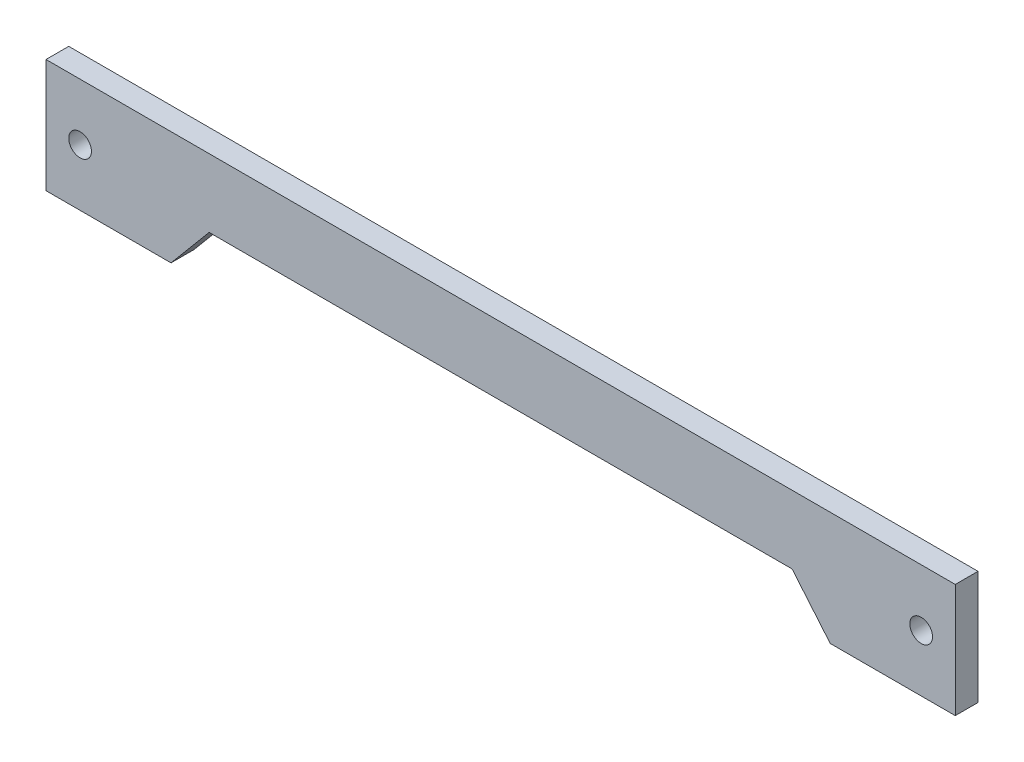
ISO-10303-21;
HEADER;
FILE_DESCRIPTION(('STEP AP214'),'2;1');
FILE_NAME('part.step','',(''),(''),'','','');
FILE_SCHEMA(('AUTOMOTIVE_DESIGN { 1 0 10303 214 1 1 1 1 }'));
ENDSEC;
DATA;
#1=APPLICATION_CONTEXT('core data for automotive mechanical design processes');
#2=APPLICATION_PROTOCOL_DEFINITION('international standard','automotive_design',2000,#1);
#3=PRODUCT_CONTEXT('',#1,'mechanical');
#4=PRODUCT('Part','Part','',(#3));
#5=PRODUCT_RELATED_PRODUCT_CATEGORY('part','',(#4));
#6=PRODUCT_DEFINITION_FORMATION('','',#4);
#7=PRODUCT_DEFINITION_CONTEXT('part definition',#1,'design');
#8=PRODUCT_DEFINITION('design','',#6,#7);
#9=PRODUCT_DEFINITION_SHAPE('','',#8);
#10=(LENGTH_UNIT() NAMED_UNIT(*) SI_UNIT(.MILLI.,.METRE.));
#11=(NAMED_UNIT(*) PLANE_ANGLE_UNIT() SI_UNIT($,.RADIAN.));
#12=(NAMED_UNIT(*) SI_UNIT($,.STERADIAN.) SOLID_ANGLE_UNIT());
#13=UNCERTAINTY_MEASURE_WITH_UNIT(LENGTH_MEASURE(1.E-05),#10,'distance_accuracy_value','');
#14=(GEOMETRIC_REPRESENTATION_CONTEXT(3) GLOBAL_UNCERTAINTY_ASSIGNED_CONTEXT((#13)) GLOBAL_UNIT_ASSIGNED_CONTEXT((#10,
#11,#12)) REPRESENTATION_CONTEXT('',''));
#15=CARTESIAN_POINT('',(0.,0.,0.));
#16=DIRECTION('',(0.,0.,1.));
#17=DIRECTION('',(1.,0.,0.));
#18=AXIS2_PLACEMENT_3D('',#15,#16,#17);
#19=CARTESIAN_POINT('',(80.,-20.,4.));
#20=DIRECTION('',(0.,1.,0.));
#21=DIRECTION('',(-1.,0.,0.));
#22=AXIS2_PLACEMENT_3D('',#19,#20,#21);
#23=PLANE('',#22);
#24=DIRECTION('',(1.,0.,0.));
#25=VECTOR('',#24,1.);
#26=CARTESIAN_POINT('',(80.,-20.,0.));
#27=LINE('',#26,#25);
#28=CARTESIAN_POINT('',(58.,-20.,0.));
#29=VERTEX_POINT('',#28);
#30=CARTESIAN_POINT('',(80.,-20.,0.));
#31=VERTEX_POINT('',#30);
#32=EDGE_CURVE('E160',#29,#31,#27,.T.);
#33=ORIENTED_EDGE('',*,*,#32,.T.);
#34=DIRECTION('',(0.,0.,-1.));
#35=VECTOR('',#34,1.);
#36=CARTESIAN_POINT('',(80.,-20.,4.));
#37=LINE('',#36,#35);
#38=CARTESIAN_POINT('',(80.,-20.,4.));
#39=VERTEX_POINT('',#38);
#40=EDGE_CURVE('E11',#39,#31,#37,.T.);
#41=ORIENTED_EDGE('',*,*,#40,.F.);
#42=DIRECTION('',(1.,0.,0.));
#43=VECTOR('',#42,1.);
#44=CARTESIAN_POINT('',(80.,-20.,4.));
#45=LINE('',#44,#43);
#46=CARTESIAN_POINT('',(58.,-20.,4.));
#47=VERTEX_POINT('',#46);
#48=EDGE_CURVE('E181',#47,#39,#45,.T.);
#49=ORIENTED_EDGE('',*,*,#48,.F.);
#50=DIRECTION('',(0.,0.,-1.));
#51=VECTOR('',#50,1.);
#52=CARTESIAN_POINT('',(58.,-20.,4.));
#53=LINE('',#52,#51);
#54=EDGE_CURVE('E156',#47,#29,#53,.T.);
#55=ORIENTED_EDGE('',*,*,#54,.T.);
#56=EDGE_LOOP('',(#33,#41,#49,#55));
#57=FACE_BOUND('',#56,.T.);
#58=ADVANCED_FACE('F42',(#57),#23,.F.);
#59=CARTESIAN_POINT('',(80.,0.,4.));
#60=DIRECTION('',(-1.,0.,0.));
#61=DIRECTION('',(0.,0.,1.));
#62=AXIS2_PLACEMENT_3D('',#59,#60,#61);
#63=PLANE('',#62);
#64=DIRECTION('',(0.,1.,0.));
#65=VECTOR('',#64,1.);
#66=CARTESIAN_POINT('',(80.,0.,0.));
#67=LINE('',#66,#65);
#68=CARTESIAN_POINT('',(80.,0.,0.));
#69=VERTEX_POINT('',#68);
#70=EDGE_CURVE('E164',#31,#69,#67,.T.);
#71=ORIENTED_EDGE('',*,*,#70,.T.);
#72=DIRECTION('',(0.,0.,-1.));
#73=VECTOR('',#72,1.);
#74=CARTESIAN_POINT('',(80.,0.,4.));
#75=LINE('',#74,#73);
#76=CARTESIAN_POINT('',(80.,0.,4.));
#77=VERTEX_POINT('',#76);
#78=EDGE_CURVE('E51',#77,#69,#75,.T.);
#79=ORIENTED_EDGE('',*,*,#78,.F.);
#80=DIRECTION('',(0.,1.,0.));
#81=VECTOR('',#80,1.);
#82=CARTESIAN_POINT('',(80.,0.,4.));
#83=LINE('',#82,#81);
#84=EDGE_CURVE('E113',#39,#77,#83,.T.);
#85=ORIENTED_EDGE('',*,*,#84,.F.);
#86=ORIENTED_EDGE('',*,*,#40,.T.);
#87=EDGE_LOOP('',(#71,#79,#85,#86));
#88=FACE_BOUND('',#87,.T.);
#89=ADVANCED_FACE('F263',(#88),#63,.F.);
#90=CARTESIAN_POINT('',(80.,0.,4.));
#91=DIRECTION('',(0.,-1.,0.));
#92=DIRECTION('',(0.,0.,-1.));
#93=AXIS2_PLACEMENT_3D('',#90,#91,#92);
#94=PLANE('',#93);
#95=DIRECTION('',(-1.,0.,0.));
#96=VECTOR('',#95,1.);
#97=CARTESIAN_POINT('',(80.,0.,0.));
#98=LINE('',#97,#96);
#99=CARTESIAN_POINT('',(-80.,0.,0.));
#100=VERTEX_POINT('',#99);
#101=EDGE_CURVE('E168',#69,#100,#98,.T.);
#102=ORIENTED_EDGE('',*,*,#101,.T.);
#103=DIRECTION('',(0.,0.,-1.));
#104=VECTOR('',#103,1.);
#105=CARTESIAN_POINT('',(-80.,0.,4.));
#106=LINE('',#105,#104);
#107=CARTESIAN_POINT('',(-80.,0.,4.));
#108=VERTEX_POINT('',#107);
#109=EDGE_CURVE('E192',#108,#100,#106,.T.);
#110=ORIENTED_EDGE('',*,*,#109,.F.);
#111=DIRECTION('',(-1.,0.,0.));
#112=VECTOR('',#111,1.);
#113=CARTESIAN_POINT('',(80.,0.,4.));
#114=LINE('',#113,#112);
#115=EDGE_CURVE('E202',#77,#108,#114,.T.);
#116=ORIENTED_EDGE('',*,*,#115,.F.);
#117=ORIENTED_EDGE('',*,*,#78,.T.);
#118=EDGE_LOOP('',(#102,#110,#116,#117));
#119=FACE_BOUND('',#118,.T.);
#120=ADVANCED_FACE('F200',(#119),#94,.F.);
#121=CARTESIAN_POINT('',(-80.,0.,4.));
#122=DIRECTION('',(1.,0.,0.));
#123=DIRECTION('',(0.,0.,-1.));
#124=AXIS2_PLACEMENT_3D('',#121,#122,#123);
#125=PLANE('',#124);
#126=DIRECTION('',(0.,-1.,0.));
#127=VECTOR('',#126,1.);
#128=CARTESIAN_POINT('',(-80.,0.,0.));
#129=LINE('',#128,#127);
#130=CARTESIAN_POINT('',(-80.,-20.,0.));
#131=VERTEX_POINT('',#130);
#132=EDGE_CURVE('E170',#100,#131,#129,.T.);
#133=ORIENTED_EDGE('',*,*,#132,.T.);
#134=DIRECTION('',(0.,0.,-1.));
#135=VECTOR('',#134,1.);
#136=CARTESIAN_POINT('',(-80.,-20.,4.));
#137=LINE('',#136,#135);
#138=CARTESIAN_POINT('',(-80.,-20.,4.));
#139=VERTEX_POINT('',#138);
#140=EDGE_CURVE('E188',#139,#131,#137,.T.);
#141=ORIENTED_EDGE('',*,*,#140,.F.);
#142=DIRECTION('',(0.,-1.,0.));
#143=VECTOR('',#142,1.);
#144=CARTESIAN_POINT('',(-80.,0.,4.));
#145=LINE('',#144,#143);
#146=EDGE_CURVE('E215',#108,#139,#145,.T.);
#147=ORIENTED_EDGE('',*,*,#146,.F.);
#148=ORIENTED_EDGE('',*,*,#109,.T.);
#149=EDGE_LOOP('',(#133,#141,#147,#148));
#150=FACE_BOUND('',#149,.T.);
#151=ADVANCED_FACE('F210',(#150),#125,.F.);
#152=CARTESIAN_POINT('',(-80.,-20.,4.));
#153=DIRECTION('',(0.,1.,0.));
#154=DIRECTION('',(0.,0.,1.));
#155=AXIS2_PLACEMENT_3D('',#152,#153,#154);
#156=PLANE('',#155);
#157=DIRECTION('',(1.,0.,0.));
#158=VECTOR('',#157,1.);
#159=CARTESIAN_POINT('',(-80.,-20.,0.));
#160=LINE('',#159,#158);
#161=CARTESIAN_POINT('',(-58.,-20.,0.));
#162=VERTEX_POINT('',#161);
#163=EDGE_CURVE('E173',#131,#162,#160,.T.);
#164=ORIENTED_EDGE('',*,*,#163,.T.);
#165=DIRECTION('',(0.,0.,-1.));
#166=VECTOR('',#165,1.);
#167=CARTESIAN_POINT('',(-58.,-20.,4.));
#168=LINE('',#167,#166);
#169=CARTESIAN_POINT('',(-58.,-20.,4.));
#170=VERTEX_POINT('',#169);
#171=EDGE_CURVE('E147',#170,#162,#168,.T.);
#172=ORIENTED_EDGE('',*,*,#171,.F.);
#173=DIRECTION('',(1.,0.,0.));
#174=VECTOR('',#173,1.);
#175=CARTESIAN_POINT('',(-80.,-20.,4.));
#176=LINE('',#175,#174);
#177=EDGE_CURVE('E136',#139,#170,#176,.T.);
#178=ORIENTED_EDGE('',*,*,#177,.F.);
#179=ORIENTED_EDGE('',*,*,#140,.T.);
#180=EDGE_LOOP('',(#164,#172,#178,#179));
#181=FACE_BOUND('',#180,.T.);
#182=ADVANCED_FACE('F213',(#181),#156,.F.);
#183=CARTESIAN_POINT('',(-58.,-20.,4.));
#184=DIRECTION('',(-0.76604444311898,0.642787609686537,0.));
#185=DIRECTION('',(-0.642787609686537,-0.76604444311898,0.));
#186=AXIS2_PLACEMENT_3D('',#183,#184,#185);
#187=PLANE('',#186);
#188=DIRECTION('',(0.642787609686537,0.76604444311898,0.));
#189=VECTOR('',#188,1.);
#190=CARTESIAN_POINT('',(-58.,-20.,0.));
#191=LINE('',#190,#189);
#192=CARTESIAN_POINT('',(-51.2872029505818,-12.,0.));
#193=VERTEX_POINT('',#192);
#194=EDGE_CURVE('E145',#162,#193,#191,.T.);
#195=ORIENTED_EDGE('',*,*,#194,.T.);
#196=DIRECTION('',(0.,0.,-1.));
#197=VECTOR('',#196,1.);
#198=CARTESIAN_POINT('',(-51.2872029505818,-12.,4.));
#199=LINE('',#198,#197);
#200=CARTESIAN_POINT('',(-51.2872029505818,-12.,4.));
#201=VERTEX_POINT('',#200);
#202=EDGE_CURVE('E142',#201,#193,#199,.T.);
#203=ORIENTED_EDGE('',*,*,#202,.F.);
#204=DIRECTION('',(0.642787609686537,0.76604444311898,0.));
#205=VECTOR('',#204,1.);
#206=CARTESIAN_POINT('',(-58.,-20.,4.));
#207=LINE('',#206,#205);
#208=EDGE_CURVE('E130',#170,#201,#207,.T.);
#209=ORIENTED_EDGE('',*,*,#208,.F.);
#210=ORIENTED_EDGE('',*,*,#171,.T.);
#211=EDGE_LOOP('',(#195,#203,#209,#210));
#212=FACE_BOUND('',#211,.T.);
#213=ADVANCED_FACE('F143',(#212),#187,.F.);
#214=CARTESIAN_POINT('',(-51.2872029505818,-12.,4.));
#215=DIRECTION('',(0.,1.,0.));
#216=DIRECTION('',(-1.,0.,0.));
#217=AXIS2_PLACEMENT_3D('',#214,#215,#216);
#218=PLANE('',#217);
#219=DIRECTION('',(1.,0.,0.));
#220=VECTOR('',#219,1.);
#221=CARTESIAN_POINT('',(-51.2872029505818,-12.,0.));
#222=LINE('',#221,#220);
#223=CARTESIAN_POINT('',(51.2872029505818,-12.,0.));
#224=VERTEX_POINT('',#223);
#225=EDGE_CURVE('E98',#193,#224,#222,.T.);
#226=ORIENTED_EDGE('',*,*,#225,.T.);
#227=DIRECTION('',(0.,0.,-1.));
#228=VECTOR('',#227,1.);
#229=CARTESIAN_POINT('',(51.2872029505818,-12.,4.));
#230=LINE('',#229,#228);
#231=CARTESIAN_POINT('',(51.2872029505818,-12.,4.));
#232=VERTEX_POINT('',#231);
#233=EDGE_CURVE('E148',#232,#224,#230,.T.);
#234=ORIENTED_EDGE('',*,*,#233,.F.);
#235=DIRECTION('',(1.,0.,0.));
#236=VECTOR('',#235,1.);
#237=CARTESIAN_POINT('',(-51.2872029505818,-12.,4.));
#238=LINE('',#237,#236);
#239=EDGE_CURVE('E134',#201,#232,#238,.T.);
#240=ORIENTED_EDGE('',*,*,#239,.F.);
#241=ORIENTED_EDGE('',*,*,#202,.T.);
#242=EDGE_LOOP('',(#226,#234,#240,#241));
#243=FACE_BOUND('',#242,.T.);
#244=ADVANCED_FACE('F150',(#243),#218,.F.);
#245=CARTESIAN_POINT('',(58.,-20.,4.));
#246=DIRECTION('',(0.76604444311898,0.642787609686537,0.));
#247=DIRECTION('',(-0.642787609686537,0.76604444311898,0.));
#248=AXIS2_PLACEMENT_3D('',#245,#246,#247);
#249=PLANE('',#248);
#250=DIRECTION('',(0.642787609686537,-0.76604444311898,0.));
#251=VECTOR('',#250,1.);
#252=CARTESIAN_POINT('',(58.,-20.,0.));
#253=LINE('',#252,#251);
#254=EDGE_CURVE('E105',#224,#29,#253,.T.);
#255=ORIENTED_EDGE('',*,*,#254,.T.);
#256=ORIENTED_EDGE('',*,*,#54,.F.);
#257=DIRECTION('',(0.642787609686537,-0.76604444311898,0.));
#258=VECTOR('',#257,1.);
#259=CARTESIAN_POINT('',(58.,-20.,4.));
#260=LINE('',#259,#258);
#261=EDGE_CURVE('E62',#232,#47,#260,.T.);
#262=ORIENTED_EDGE('',*,*,#261,.F.);
#263=ORIENTED_EDGE('',*,*,#233,.T.);
#264=EDGE_LOOP('',(#255,#256,#262,#263));
#265=FACE_BOUND('',#264,.T.);
#266=ADVANCED_FACE('F250',(#265),#249,.F.);
#267=CARTESIAN_POINT('',(0.,0.,4.));
#268=DIRECTION('',(0.,0.,1.));
#269=DIRECTION('',(1.,0.,0.));
#270=AXIS2_PLACEMENT_3D('',#267,#268,#269);
#271=PLANE('',#270);
#272=CARTESIAN_POINT('',(-74.,-10.,4.));
#273=DIRECTION('',(0.,0.,1.));
#274=DIRECTION('',(1.,0.,0.));
#275=AXIS2_PLACEMENT_3D('',#272,#273,#274);
#276=CIRCLE('',#275,2.);
#277=CARTESIAN_POINT('',(-72.,-10.,4.));
#278=VERTEX_POINT('',#277);
#279=EDGE_CURVE('E232',#278,#278,#276,.T.);
#280=ORIENTED_EDGE('',*,*,#279,.F.);
#281=EDGE_LOOP('',(#280));
#282=FACE_BOUND('',#281,.T.);
#283=CARTESIAN_POINT('',(74.,-9.99999999999998,4.));
#284=DIRECTION('',(0.,0.,1.));
#285=DIRECTION('',(-1.,0.,0.));
#286=AXIS2_PLACEMENT_3D('',#283,#284,#285);
#287=CIRCLE('',#286,2.);
#288=CARTESIAN_POINT('',(72.,-9.99999999999998,4.));
#289=VERTEX_POINT('',#288);
#290=EDGE_CURVE('E224',#289,#289,#287,.T.);
#291=ORIENTED_EDGE('',*,*,#290,.F.);
#292=EDGE_LOOP('',(#291));
#293=FACE_BOUND('',#292,.T.);
#294=ORIENTED_EDGE('',*,*,#48,.T.);
#295=ORIENTED_EDGE('',*,*,#84,.T.);
#296=ORIENTED_EDGE('',*,*,#115,.T.);
#297=ORIENTED_EDGE('',*,*,#146,.T.);
#298=ORIENTED_EDGE('',*,*,#177,.T.);
#299=ORIENTED_EDGE('',*,*,#208,.T.);
#300=ORIENTED_EDGE('',*,*,#239,.T.);
#301=ORIENTED_EDGE('',*,*,#261,.T.);
#302=EDGE_LOOP('',(#294,#295,#296,#297,#298,#299,#300,#301));
#303=FACE_BOUND('',#302,.T.);
#304=ADVANCED_FACE('F132',(#282,#293,#303),#271,.T.);
#305=CARTESIAN_POINT('',(0.,0.,0.));
#306=DIRECTION('',(0.,0.,1.));
#307=DIRECTION('',(1.,0.,0.));
#308=AXIS2_PLACEMENT_3D('',#305,#306,#307);
#309=PLANE('',#308);
#310=CARTESIAN_POINT('',(-74.,-10.,0.));
#311=DIRECTION('',(0.,0.,1.));
#312=DIRECTION('',(1.,0.,0.));
#313=AXIS2_PLACEMENT_3D('',#310,#311,#312);
#314=CIRCLE('',#313,2.);
#315=CARTESIAN_POINT('',(-72.,-10.,0.));
#316=VERTEX_POINT('',#315);
#317=EDGE_CURVE('E165',#316,#316,#314,.T.);
#318=ORIENTED_EDGE('',*,*,#317,.T.);
#319=EDGE_LOOP('',(#318));
#320=FACE_BOUND('',#319,.T.);
#321=CARTESIAN_POINT('',(74.,-9.99999999999998,0.));
#322=DIRECTION('',(0.,0.,1.));
#323=DIRECTION('',(-1.,0.,0.));
#324=AXIS2_PLACEMENT_3D('',#321,#322,#323);
#325=CIRCLE('',#324,2.);
#326=CARTESIAN_POINT('',(72.,-9.99999999999998,0.));
#327=VERTEX_POINT('',#326);
#328=EDGE_CURVE('E228',#327,#327,#325,.T.);
#329=ORIENTED_EDGE('',*,*,#328,.T.);
#330=EDGE_LOOP('',(#329));
#331=FACE_BOUND('',#330,.T.);
#332=ORIENTED_EDGE('',*,*,#32,.F.);
#333=ORIENTED_EDGE('',*,*,#254,.F.);
#334=ORIENTED_EDGE('',*,*,#225,.F.);
#335=ORIENTED_EDGE('',*,*,#194,.F.);
#336=ORIENTED_EDGE('',*,*,#163,.F.);
#337=ORIENTED_EDGE('',*,*,#132,.F.);
#338=ORIENTED_EDGE('',*,*,#101,.F.);
#339=ORIENTED_EDGE('',*,*,#70,.F.);
#340=EDGE_LOOP('',(#332,#333,#334,#335,#336,#337,#338,#339));
#341=FACE_BOUND('',#340,.T.);
#342=ADVANCED_FACE('F206',(#320,#331,#341),#309,.F.);
#343=CARTESIAN_POINT('',(74.,-9.99999999999998,0.));
#344=DIRECTION('',(0.,0.,1.));
#345=DIRECTION('',(1.,0.,0.));
#346=AXIS2_PLACEMENT_3D('',#343,#344,#345);
#347=CYLINDRICAL_SURFACE('',#346,2.);
#348=ORIENTED_EDGE('',*,*,#328,.F.);
#349=EDGE_LOOP('',(#348));
#350=FACE_BOUND('',#349,.T.);
#351=ORIENTED_EDGE('',*,*,#290,.T.);
#352=EDGE_LOOP('',(#351));
#353=FACE_BOUND('',#352,.T.);
#354=ADVANCED_FACE('F244',(#350,#353),#347,.F.);
#355=CARTESIAN_POINT('',(-74.,-10.,0.));
#356=DIRECTION('',(0.,0.,1.));
#357=DIRECTION('',(1.,0.,0.));
#358=AXIS2_PLACEMENT_3D('',#355,#356,#357);
#359=CYLINDRICAL_SURFACE('',#358,2.);
#360=ORIENTED_EDGE('',*,*,#317,.F.);
#361=EDGE_LOOP('',(#360));
#362=FACE_BOUND('',#361,.T.);
#363=ORIENTED_EDGE('',*,*,#279,.T.);
#364=EDGE_LOOP('',(#363));
#365=FACE_BOUND('',#364,.T.);
#366=ADVANCED_FACE('F241',(#362,#365),#359,.F.);
#367=CLOSED_SHELL('',(#58,#89,#120,#151,#182,#213,#244,#266,#304,#342,#354,#366));
#368=MANIFOLD_SOLID_BREP('B2',#367);
#369=ADVANCED_BREP_SHAPE_REPRESENTATION('',(#18,#368),#14);
#370=SHAPE_DEFINITION_REPRESENTATION(#9,#369);
ENDSEC;
END-ISO-10303-21;
